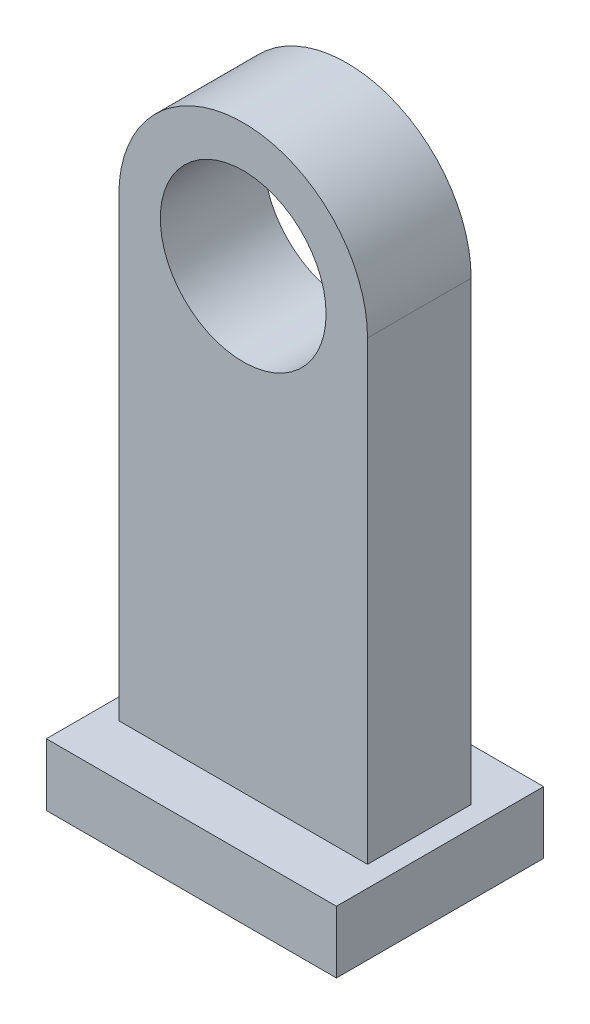
ISO-10303-21;
HEADER;
FILE_DESCRIPTION(('STEP AP214'),'2;1');
FILE_NAME('part.step','',(''),(''),'','','');
FILE_SCHEMA(('AUTOMOTIVE_DESIGN { 1 0 10303 214 1 1 1 1 }'));
ENDSEC;
DATA;
#1=APPLICATION_CONTEXT('core data for automotive mechanical design processes');
#2=APPLICATION_PROTOCOL_DEFINITION('international standard','automotive_design',2000,#1);
#3=PRODUCT_CONTEXT('',#1,'mechanical');
#4=PRODUCT('Part','Part','',(#3));
#5=PRODUCT_RELATED_PRODUCT_CATEGORY('part','',(#4));
#6=PRODUCT_DEFINITION_FORMATION('','',#4);
#7=PRODUCT_DEFINITION_CONTEXT('part definition',#1,'design');
#8=PRODUCT_DEFINITION('design','',#6,#7);
#9=PRODUCT_DEFINITION_SHAPE('','',#8);
#10=(LENGTH_UNIT() NAMED_UNIT(*) SI_UNIT(.MILLI.,.METRE.));
#11=(NAMED_UNIT(*) PLANE_ANGLE_UNIT() SI_UNIT($,.RADIAN.));
#12=(NAMED_UNIT(*) SI_UNIT($,.STERADIAN.) SOLID_ANGLE_UNIT());
#13=UNCERTAINTY_MEASURE_WITH_UNIT(LENGTH_MEASURE(1.E-05),#10,'distance_accuracy_value','');
#14=(GEOMETRIC_REPRESENTATION_CONTEXT(3) GLOBAL_UNCERTAINTY_ASSIGNED_CONTEXT((#13)) GLOBAL_UNIT_ASSIGNED_CONTEXT((#10,
#11,#12)) REPRESENTATION_CONTEXT('',''));
#15=CARTESIAN_POINT('',(0.,0.,0.));
#16=DIRECTION('',(0.,0.,1.));
#17=DIRECTION('',(1.,0.,0.));
#18=AXIS2_PLACEMENT_3D('',#15,#16,#17);
#19=CARTESIAN_POINT('',(0.,0.,5.));
#20=DIRECTION('',(0.,0.,-1.));
#21=DIRECTION('',(-1.,0.,0.));
#22=AXIS2_PLACEMENT_3D('',#19,#20,#21);
#23=CYLINDRICAL_SURFACE('',#22,6.);
#24=DIRECTION('',(0.,0.,1.));
#25=VECTOR('',#24,1.);
#26=CARTESIAN_POINT('',(-6.,0.,5.));
#27=LINE('',#26,#25);
#28=CARTESIAN_POINT('',(-6.,0.,0.));
#29=VERTEX_POINT('',#28);
#30=CARTESIAN_POINT('',(-6.,0.,5.));
#31=VERTEX_POINT('',#30);
#32=EDGE_CURVE('E138',#29,#31,#27,.T.);
#33=ORIENTED_EDGE('',*,*,#32,.T.);
#34=CARTESIAN_POINT('',(0.,0.,5.));
#35=DIRECTION('',(0.,0.,1.));
#36=DIRECTION('',(1.,0.,0.));
#37=AXIS2_PLACEMENT_3D('',#34,#35,#36);
#38=CIRCLE('',#37,6.);
#39=CARTESIAN_POINT('',(6.,0.,5.));
#40=VERTEX_POINT('',#39);
#41=EDGE_CURVE('E11',#40,#31,#38,.T.);
#42=ORIENTED_EDGE('',*,*,#41,.F.);
#43=DIRECTION('',(0.,0.,-1.));
#44=VECTOR('',#43,1.);
#45=CARTESIAN_POINT('',(6.,0.,0.));
#46=LINE('',#45,#44);
#47=CARTESIAN_POINT('',(6.,0.,0.));
#48=VERTEX_POINT('',#47);
#49=EDGE_CURVE('E64',#40,#48,#46,.T.);
#50=ORIENTED_EDGE('',*,*,#49,.T.);
#51=CARTESIAN_POINT('',(0.,0.,0.));
#52=DIRECTION('',(0.,0.,1.));
#53=DIRECTION('',(1.,0.,0.));
#54=AXIS2_PLACEMENT_3D('',#51,#52,#53);
#55=CIRCLE('',#54,6.);
#56=EDGE_CURVE('E48',#48,#29,#55,.T.);
#57=ORIENTED_EDGE('',*,*,#56,.T.);
#58=EDGE_LOOP('',(#33,#42,#50,#57));
#59=FACE_BOUND('',#58,.T.);
#60=ADVANCED_FACE('F45',(#59),#23,.T.);
#61=CARTESIAN_POINT('',(0.,0.,5.));
#62=DIRECTION('',(0.,0.,-1.));
#63=DIRECTION('',(-1.,0.,0.));
#64=AXIS2_PLACEMENT_3D('',#61,#62,#63);
#65=CYLINDRICAL_SURFACE('',#64,4.);
#66=CARTESIAN_POINT('',(0.,0.,5.));
#67=DIRECTION('',(0.,0.,1.));
#68=DIRECTION('',(1.,0.,0.));
#69=AXIS2_PLACEMENT_3D('',#66,#67,#68);
#70=CIRCLE('',#69,4.);
#71=CARTESIAN_POINT('',(4.,0.,5.));
#72=VERTEX_POINT('',#71);
#73=EDGE_CURVE('E178',#72,#72,#70,.T.);
#74=ORIENTED_EDGE('',*,*,#73,.T.);
#75=EDGE_LOOP('',(#74));
#76=FACE_BOUND('',#75,.T.);
#77=CARTESIAN_POINT('',(0.,0.,0.));
#78=DIRECTION('',(0.,0.,1.));
#79=DIRECTION('',(1.,0.,0.));
#80=AXIS2_PLACEMENT_3D('',#77,#78,#79);
#81=CIRCLE('',#80,4.);
#82=CARTESIAN_POINT('',(4.,0.,0.));
#83=VERTEX_POINT('',#82);
#84=EDGE_CURVE('E167',#83,#83,#81,.T.);
#85=ORIENTED_EDGE('',*,*,#84,.F.);
#86=EDGE_LOOP('',(#85));
#87=FACE_BOUND('',#86,.T.);
#88=ADVANCED_FACE('F189',(#76,#87),#65,.F.);
#89=CARTESIAN_POINT('',(0.,0.,5.));
#90=DIRECTION('',(0.,0.,1.));
#91=DIRECTION('',(1.,0.,0.));
#92=AXIS2_PLACEMENT_3D('',#89,#90,#91);
#93=PLANE('',#92);
#94=ORIENTED_EDGE('',*,*,#73,.F.);
#95=EDGE_LOOP('',(#94));
#96=FACE_BOUND('',#95,.T.);
#97=ORIENTED_EDGE('',*,*,#41,.T.);
#98=DIRECTION('',(0.,1.,0.));
#99=VECTOR('',#98,1.);
#100=CARTESIAN_POINT('',(-6.,-22.,5.));
#101=LINE('',#100,#99);
#102=CARTESIAN_POINT('',(-6.,-22.,5.));
#103=VERTEX_POINT('',#102);
#104=EDGE_CURVE('E163',#103,#31,#101,.T.);
#105=ORIENTED_EDGE('',*,*,#104,.F.);
#106=DIRECTION('',(1.,0.,0.));
#107=VECTOR('',#106,1.);
#108=CARTESIAN_POINT('',(6.,-22.,5.));
#109=LINE('',#108,#107);
#110=CARTESIAN_POINT('',(6.,-22.,5.));
#111=VERTEX_POINT('',#110);
#112=EDGE_CURVE('E144',#103,#111,#109,.T.);
#113=ORIENTED_EDGE('',*,*,#112,.T.);
#114=DIRECTION('',(0.,1.,0.));
#115=VECTOR('',#114,1.);
#116=CARTESIAN_POINT('',(6.,-22.,5.));
#117=LINE('',#116,#115);
#118=EDGE_CURVE('E159',#111,#40,#117,.T.);
#119=ORIENTED_EDGE('',*,*,#118,.T.);
#120=EDGE_LOOP('',(#97,#105,#113,#119));
#121=FACE_BOUND('',#120,.T.);
#122=ADVANCED_FACE('F191',(#96,#121),#93,.T.);
#123=CARTESIAN_POINT('',(0.,0.,0.));
#124=DIRECTION('',(0.,0.,1.));
#125=DIRECTION('',(1.,0.,0.));
#126=AXIS2_PLACEMENT_3D('',#123,#124,#125);
#127=PLANE('',#126);
#128=ORIENTED_EDGE('',*,*,#84,.T.);
#129=EDGE_LOOP('',(#128));
#130=FACE_BOUND('',#129,.T.);
#131=DIRECTION('',(0.,1.,0.));
#132=VECTOR('',#131,1.);
#133=CARTESIAN_POINT('',(-6.,-22.,0.));
#134=LINE('',#133,#132);
#135=CARTESIAN_POINT('',(-6.,-22.,0.));
#136=VERTEX_POINT('',#135);
#137=EDGE_CURVE('E168',#136,#29,#134,.T.);
#138=ORIENTED_EDGE('',*,*,#137,.T.);
#139=ORIENTED_EDGE('',*,*,#56,.F.);
#140=DIRECTION('',(0.,1.,0.));
#141=VECTOR('',#140,1.);
#142=CARTESIAN_POINT('',(6.,-22.,0.));
#143=LINE('',#142,#141);
#144=CARTESIAN_POINT('',(6.,-22.,0.));
#145=VERTEX_POINT('',#144);
#146=EDGE_CURVE('E171',#145,#48,#143,.T.);
#147=ORIENTED_EDGE('',*,*,#146,.F.);
#148=DIRECTION('',(-1.,0.,0.));
#149=VECTOR('',#148,1.);
#150=CARTESIAN_POINT('',(-6.,-22.,0.));
#151=LINE('',#150,#149);
#152=EDGE_CURVE('E152',#145,#136,#151,.T.);
#153=ORIENTED_EDGE('',*,*,#152,.T.);
#154=EDGE_LOOP('',(#138,#139,#147,#153));
#155=FACE_BOUND('',#154,.T.);
#156=ADVANCED_FACE('F186',(#130,#155),#127,.F.);
#157=CARTESIAN_POINT('',(-6.,-22.,5.));
#158=DIRECTION('',(-1.,0.,0.));
#159=DIRECTION('',(0.,0.,1.));
#160=AXIS2_PLACEMENT_3D('',#157,#158,#159);
#161=PLANE('',#160);
#162=ORIENTED_EDGE('',*,*,#32,.F.);
#163=ORIENTED_EDGE('',*,*,#137,.F.);
#164=DIRECTION('',(0.,0.,1.));
#165=VECTOR('',#164,1.);
#166=CARTESIAN_POINT('',(-6.,-22.,5.));
#167=LINE('',#166,#165);
#168=EDGE_CURVE('E156',#136,#103,#167,.T.);
#169=ORIENTED_EDGE('',*,*,#168,.T.);
#170=ORIENTED_EDGE('',*,*,#104,.T.);
#171=EDGE_LOOP('',(#162,#163,#169,#170));
#172=FACE_BOUND('',#171,.T.);
#173=ADVANCED_FACE('F204',(#172),#161,.T.);
#174=CARTESIAN_POINT('',(6.,-22.,0.));
#175=DIRECTION('',(1.,0.,0.));
#176=DIRECTION('',(0.,0.,-1.));
#177=AXIS2_PLACEMENT_3D('',#174,#175,#176);
#178=PLANE('',#177);
#179=ORIENTED_EDGE('',*,*,#49,.F.);
#180=ORIENTED_EDGE('',*,*,#118,.F.);
#181=DIRECTION('',(0.,0.,-1.));
#182=VECTOR('',#181,1.);
#183=CARTESIAN_POINT('',(6.,-22.,0.));
#184=LINE('',#183,#182);
#185=EDGE_CURVE('E148',#111,#145,#184,.T.);
#186=ORIENTED_EDGE('',*,*,#185,.T.);
#187=ORIENTED_EDGE('',*,*,#146,.T.);
#188=EDGE_LOOP('',(#179,#180,#186,#187));
#189=FACE_BOUND('',#188,.T.);
#190=ADVANCED_FACE('F201',(#189),#178,.T.);
#191=CARTESIAN_POINT('',(0.,-22.,0.));
#192=DIRECTION('',(0.,1.,0.));
#193=DIRECTION('',(0.,0.,1.));
#194=AXIS2_PLACEMENT_3D('',#191,#192,#193);
#195=PLANE('',#194);
#196=DIRECTION('',(1.,0.,0.));
#197=VECTOR('',#196,1.);
#198=CARTESIAN_POINT('',(7.,-22.,-2.5));
#199=LINE('',#198,#197);
#200=CARTESIAN_POINT('',(-7.,-22.,-2.5));
#201=VERTEX_POINT('',#200);
#202=CARTESIAN_POINT('',(7.,-22.,-2.5));
#203=VERTEX_POINT('',#202);
#204=EDGE_CURVE('E133',#201,#203,#199,.T.);
#205=ORIENTED_EDGE('',*,*,#204,.F.);
#206=DIRECTION('',(0.,0.,-1.));
#207=VECTOR('',#206,1.);
#208=CARTESIAN_POINT('',(-7.,-22.,-2.5));
#209=LINE('',#208,#207);
#210=CARTESIAN_POINT('',(-7.,-22.,7.5));
#211=VERTEX_POINT('',#210);
#212=EDGE_CURVE('E129',#211,#201,#209,.T.);
#213=ORIENTED_EDGE('',*,*,#212,.F.);
#214=DIRECTION('',(-1.,0.,0.));
#215=VECTOR('',#214,1.);
#216=CARTESIAN_POINT('',(-7.,-22.,7.5));
#217=LINE('',#216,#215);
#218=CARTESIAN_POINT('',(7.,-22.,7.5));
#219=VERTEX_POINT('',#218);
#220=EDGE_CURVE('E320',#219,#211,#217,.T.);
#221=ORIENTED_EDGE('',*,*,#220,.F.);
#222=DIRECTION('',(0.,0.,1.));
#223=VECTOR('',#222,1.);
#224=CARTESIAN_POINT('',(7.,-22.,7.5));
#225=LINE('',#224,#223);
#226=EDGE_CURVE('E316',#203,#219,#225,.T.);
#227=ORIENTED_EDGE('',*,*,#226,.F.);
#228=EDGE_LOOP('',(#205,#213,#221,#227));
#229=FACE_BOUND('',#228,.T.);
#230=ORIENTED_EDGE('',*,*,#112,.F.);
#231=ORIENTED_EDGE('',*,*,#168,.F.);
#232=ORIENTED_EDGE('',*,*,#152,.F.);
#233=ORIENTED_EDGE('',*,*,#185,.F.);
#234=EDGE_LOOP('',(#230,#231,#232,#233));
#235=FACE_BOUND('',#234,.T.);
#236=ADVANCED_FACE('F212',(#229,#235),#195,.T.);
#237=CARTESIAN_POINT('',(7.,-25.,-2.5));
#238=DIRECTION('',(0.,0.,1.));
#239=DIRECTION('',(1.,0.,0.));
#240=AXIS2_PLACEMENT_3D('',#237,#238,#239);
#241=PLANE('',#240);
#242=ORIENTED_EDGE('',*,*,#204,.T.);
#243=DIRECTION('',(0.,1.,0.));
#244=VECTOR('',#243,1.);
#245=CARTESIAN_POINT('',(7.,-25.,-2.5));
#246=LINE('',#245,#244);
#247=CARTESIAN_POINT('',(7.,-25.,-2.5));
#248=VERTEX_POINT('',#247);
#249=EDGE_CURVE('E111',#248,#203,#246,.T.);
#250=ORIENTED_EDGE('',*,*,#249,.F.);
#251=DIRECTION('',(1.,0.,0.));
#252=VECTOR('',#251,1.);
#253=CARTESIAN_POINT('',(7.,-25.,-2.5));
#254=LINE('',#253,#252);
#255=CARTESIAN_POINT('',(-7.,-25.,-2.5));
#256=VERTEX_POINT('',#255);
#257=EDGE_CURVE('E119',#256,#248,#254,.T.);
#258=ORIENTED_EDGE('',*,*,#257,.F.);
#259=DIRECTION('',(0.,1.,0.));
#260=VECTOR('',#259,1.);
#261=CARTESIAN_POINT('',(-7.,-25.,-2.5));
#262=LINE('',#261,#260);
#263=EDGE_CURVE('E329',#256,#201,#262,.T.);
#264=ORIENTED_EDGE('',*,*,#263,.T.);
#265=EDGE_LOOP('',(#242,#250,#258,#264));
#266=FACE_BOUND('',#265,.T.);
#267=ADVANCED_FACE('F131',(#266),#241,.F.);
#268=CARTESIAN_POINT('',(7.,-25.,7.5));
#269=DIRECTION('',(-1.,0.,0.));
#270=DIRECTION('',(0.,0.,1.));
#271=AXIS2_PLACEMENT_3D('',#268,#269,#270);
#272=PLANE('',#271);
#273=ORIENTED_EDGE('',*,*,#226,.T.);
#274=DIRECTION('',(0.,1.,0.));
#275=VECTOR('',#274,1.);
#276=CARTESIAN_POINT('',(7.,-25.,7.5));
#277=LINE('',#276,#275);
#278=CARTESIAN_POINT('',(7.,-25.,7.5));
#279=VERTEX_POINT('',#278);
#280=EDGE_CURVE('E114',#279,#219,#277,.T.);
#281=ORIENTED_EDGE('',*,*,#280,.F.);
#282=DIRECTION('',(0.,0.,1.));
#283=VECTOR('',#282,1.);
#284=CARTESIAN_POINT('',(7.,-25.,7.5));
#285=LINE('',#284,#283);
#286=EDGE_CURVE('E107',#248,#279,#285,.T.);
#287=ORIENTED_EDGE('',*,*,#286,.F.);
#288=ORIENTED_EDGE('',*,*,#249,.T.);
#289=EDGE_LOOP('',(#273,#281,#287,#288));
#290=FACE_BOUND('',#289,.T.);
#291=ADVANCED_FACE('F109',(#290),#272,.F.);
#292=CARTESIAN_POINT('',(-7.,-25.,7.5));
#293=DIRECTION('',(0.,0.,-1.));
#294=DIRECTION('',(-1.,0.,0.));
#295=AXIS2_PLACEMENT_3D('',#292,#293,#294);
#296=PLANE('',#295);
#297=ORIENTED_EDGE('',*,*,#220,.T.);
#298=DIRECTION('',(0.,1.,0.));
#299=VECTOR('',#298,1.);
#300=CARTESIAN_POINT('',(-7.,-25.,7.5));
#301=LINE('',#300,#299);
#302=CARTESIAN_POINT('',(-7.,-25.,7.5));
#303=VERTEX_POINT('',#302);
#304=EDGE_CURVE('E140',#303,#211,#301,.T.);
#305=ORIENTED_EDGE('',*,*,#304,.F.);
#306=DIRECTION('',(-1.,0.,0.));
#307=VECTOR('',#306,1.);
#308=CARTESIAN_POINT('',(-7.,-25.,7.5));
#309=LINE('',#308,#307);
#310=EDGE_CURVE('E118',#279,#303,#309,.T.);
#311=ORIENTED_EDGE('',*,*,#310,.F.);
#312=ORIENTED_EDGE('',*,*,#280,.T.);
#313=EDGE_LOOP('',(#297,#305,#311,#312));
#314=FACE_BOUND('',#313,.T.);
#315=ADVANCED_FACE('F220',(#314),#296,.F.);
#316=CARTESIAN_POINT('',(-7.,-25.,-2.5));
#317=DIRECTION('',(1.,0.,0.));
#318=DIRECTION('',(0.,0.,-1.));
#319=AXIS2_PLACEMENT_3D('',#316,#317,#318);
#320=PLANE('',#319);
#321=ORIENTED_EDGE('',*,*,#212,.T.);
#322=ORIENTED_EDGE('',*,*,#263,.F.);
#323=DIRECTION('',(0.,0.,-1.));
#324=VECTOR('',#323,1.);
#325=CARTESIAN_POINT('',(-7.,-25.,-2.5));
#326=LINE('',#325,#324);
#327=EDGE_CURVE('E124',#303,#256,#326,.T.);
#328=ORIENTED_EDGE('',*,*,#327,.F.);
#329=ORIENTED_EDGE('',*,*,#304,.T.);
#330=EDGE_LOOP('',(#321,#322,#328,#329));
#331=FACE_BOUND('',#330,.T.);
#332=ADVANCED_FACE('F223',(#331),#320,.F.);
#333=CARTESIAN_POINT('',(0.,-25.,0.));
#334=DIRECTION('',(0.,1.,0.));
#335=DIRECTION('',(0.,0.,1.));
#336=AXIS2_PLACEMENT_3D('',#333,#334,#335);
#337=PLANE('',#336);
#338=ORIENTED_EDGE('',*,*,#257,.T.);
#339=ORIENTED_EDGE('',*,*,#286,.T.);
#340=ORIENTED_EDGE('',*,*,#310,.T.);
#341=ORIENTED_EDGE('',*,*,#327,.T.);
#342=EDGE_LOOP('',(#338,#339,#340,#341));
#343=FACE_BOUND('',#342,.T.);
#344=ADVANCED_FACE('F122',(#343),#337,.F.);
#345=CLOSED_SHELL('',(#60,#88,#122,#156,#173,#190,#236,#267,#291,#315,#332,#344));
#346=MANIFOLD_SOLID_BREP('B2',#345);
#347=ADVANCED_BREP_SHAPE_REPRESENTATION('',(#18,#346),#14);
#348=SHAPE_DEFINITION_REPRESENTATION(#9,#347);
ENDSEC;
END-ISO-10303-21;
